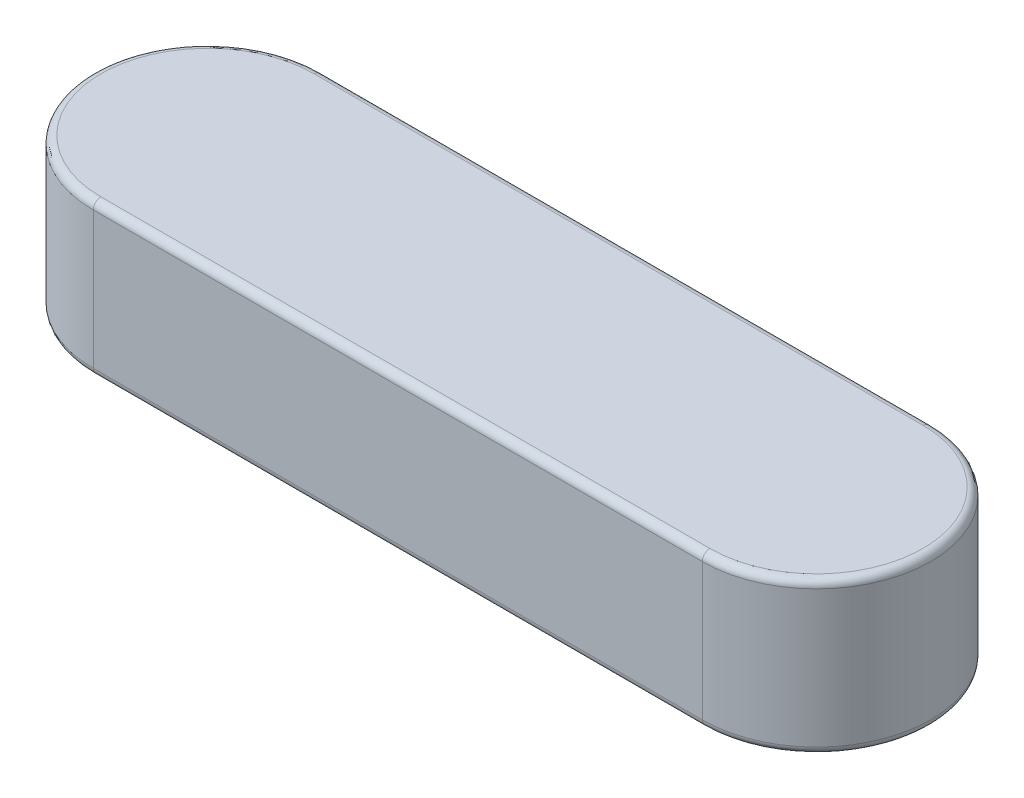
ISO-10303-21;
HEADER;
FILE_DESCRIPTION(('STEP AP214'),'2;1');
FILE_NAME('part.step','',(''),(''),'','','');
FILE_SCHEMA(('AUTOMOTIVE_DESIGN { 1 0 10303 214 1 1 1 1 }'));
ENDSEC;
DATA;
#1=APPLICATION_CONTEXT('core data for automotive mechanical design processes');
#2=APPLICATION_PROTOCOL_DEFINITION('international standard','automotive_design',2000,#1);
#3=PRODUCT_CONTEXT('',#1,'mechanical');
#4=PRODUCT('Part','Part','',(#3));
#5=PRODUCT_RELATED_PRODUCT_CATEGORY('part','',(#4));
#6=PRODUCT_DEFINITION_FORMATION('','',#4);
#7=PRODUCT_DEFINITION_CONTEXT('part definition',#1,'design');
#8=PRODUCT_DEFINITION('design','',#6,#7);
#9=PRODUCT_DEFINITION_SHAPE('','',#8);
#10=(LENGTH_UNIT() NAMED_UNIT(*) SI_UNIT(.MILLI.,.METRE.));
#11=(NAMED_UNIT(*) PLANE_ANGLE_UNIT() SI_UNIT($,.RADIAN.));
#12=(NAMED_UNIT(*) SI_UNIT($,.STERADIAN.) SOLID_ANGLE_UNIT());
#13=UNCERTAINTY_MEASURE_WITH_UNIT(LENGTH_MEASURE(1.E-05),#10,'distance_accuracy_value','');
#14=(GEOMETRIC_REPRESENTATION_CONTEXT(3) GLOBAL_UNCERTAINTY_ASSIGNED_CONTEXT((#13)) GLOBAL_UNIT_ASSIGNED_CONTEXT((#10,
#11,#12)) REPRESENTATION_CONTEXT('',''));
#15=CARTESIAN_POINT('',(0.,0.,0.));
#16=DIRECTION('',(0.,0.,1.));
#17=DIRECTION('',(1.,0.,0.));
#18=AXIS2_PLACEMENT_3D('',#15,#16,#17);
#19=CARTESIAN_POINT('',(-8.,4.,0.));
#20=DIRECTION('',(0.,-1.,0.));
#21=DIRECTION('',(0.,0.,-1.));
#22=AXIS2_PLACEMENT_3D('',#19,#20,#21);
#23=CYLINDRICAL_SURFACE('',#22,3.);
#24=DIRECTION('',(0.,-1.,0.));
#25=VECTOR('',#24,1.);
#26=CARTESIAN_POINT('',(-8.,4.,-3.));
#27=LINE('',#26,#25);
#28=CARTESIAN_POINT('',(-8.,3.8,-3.));
#29=VERTEX_POINT('',#28);
#30=CARTESIAN_POINT('',(-8.,0.2,-3.));
#31=VERTEX_POINT('',#30);
#32=EDGE_CURVE('E126',#29,#31,#27,.T.);
#33=ORIENTED_EDGE('',*,*,#32,.T.);
#34=CARTESIAN_POINT('',(-8.,0.2,0.));
#35=DIRECTION('',(0.,1.,0.));
#36=DIRECTION('',(0.,0.,1.));
#37=AXIS2_PLACEMENT_3D('',#34,#35,#36);
#38=CIRCLE('',#37,3.);
#39=CARTESIAN_POINT('',(-8.,0.2,3.));
#40=VERTEX_POINT('',#39);
#41=EDGE_CURVE('E135',#31,#40,#38,.T.);
#42=ORIENTED_EDGE('',*,*,#41,.T.);
#43=DIRECTION('',(0.,-1.,0.));
#44=VECTOR('',#43,1.);
#45=CARTESIAN_POINT('',(-8.,4.,3.));
#46=LINE('',#45,#44);
#47=CARTESIAN_POINT('',(-8.,3.8,3.));
#48=VERTEX_POINT('',#47);
#49=EDGE_CURVE('E104',#48,#40,#46,.T.);
#50=ORIENTED_EDGE('',*,*,#49,.F.);
#51=CARTESIAN_POINT('',(-8.,3.8,0.));
#52=DIRECTION('',(0.,1.,0.));
#53=DIRECTION('',(0.,0.,1.));
#54=AXIS2_PLACEMENT_3D('',#51,#52,#53);
#55=CIRCLE('',#54,3.);
#56=EDGE_CURVE('E137',#48,#29,#55,.F.);
#57=ORIENTED_EDGE('',*,*,#56,.T.);
#58=EDGE_LOOP('',(#33,#42,#50,#57));
#59=FACE_BOUND('',#58,.T.);
#60=ADVANCED_FACE('F17',(#59),#23,.T.);
#61=CARTESIAN_POINT('',(-8.,4.,3.));
#62=DIRECTION('',(0.,0.,-1.));
#63=DIRECTION('',(-1.,0.,0.));
#64=AXIS2_PLACEMENT_3D('',#61,#62,#63);
#65=PLANE('',#64);
#66=ORIENTED_EDGE('',*,*,#49,.T.);
#67=DIRECTION('',(1.,0.,0.));
#68=VECTOR('',#67,1.);
#69=CARTESIAN_POINT('',(-8.,0.2,3.));
#70=LINE('',#69,#68);
#71=CARTESIAN_POINT('',(8.,0.2,3.));
#72=VERTEX_POINT('',#71);
#73=EDGE_CURVE('E103',#40,#72,#70,.T.);
#74=ORIENTED_EDGE('',*,*,#73,.T.);
#75=DIRECTION('',(0.,-1.,0.));
#76=VECTOR('',#75,1.);
#77=CARTESIAN_POINT('',(8.,4.,3.));
#78=LINE('',#77,#76);
#79=CARTESIAN_POINT('',(8.,3.8,3.));
#80=VERTEX_POINT('',#79);
#81=EDGE_CURVE('E86',#80,#72,#78,.T.);
#82=ORIENTED_EDGE('',*,*,#81,.F.);
#83=DIRECTION('',(1.,0.,0.));
#84=VECTOR('',#83,1.);
#85=CARTESIAN_POINT('',(-8.,3.8,3.));
#86=LINE('',#85,#84);
#87=EDGE_CURVE('E100',#80,#48,#86,.F.);
#88=ORIENTED_EDGE('',*,*,#87,.T.);
#89=EDGE_LOOP('',(#66,#74,#82,#88));
#90=FACE_BOUND('',#89,.T.);
#91=ADVANCED_FACE('F99',(#90),#65,.F.);
#92=CARTESIAN_POINT('',(8.,4.,0.));
#93=DIRECTION('',(0.,-1.,0.));
#94=DIRECTION('',(0.,0.,-1.));
#95=AXIS2_PLACEMENT_3D('',#92,#93,#94);
#96=CYLINDRICAL_SURFACE('',#95,3.);
#97=ORIENTED_EDGE('',*,*,#81,.T.);
#98=CARTESIAN_POINT('',(8.,0.2,0.));
#99=DIRECTION('',(0.,1.,0.));
#100=DIRECTION('',(0.,0.,1.));
#101=AXIS2_PLACEMENT_3D('',#98,#99,#100);
#102=CIRCLE('',#101,3.);
#103=CARTESIAN_POINT('',(8.,0.2,-3.));
#104=VERTEX_POINT('',#103);
#105=EDGE_CURVE('E92',#72,#104,#102,.T.);
#106=ORIENTED_EDGE('',*,*,#105,.T.);
#107=DIRECTION('',(0.,-1.,0.));
#108=VECTOR('',#107,1.);
#109=CARTESIAN_POINT('',(8.,4.,-3.));
#110=LINE('',#109,#108);
#111=CARTESIAN_POINT('',(8.,3.8,-3.));
#112=VERTEX_POINT('',#111);
#113=EDGE_CURVE('E88',#112,#104,#110,.T.);
#114=ORIENTED_EDGE('',*,*,#113,.F.);
#115=CARTESIAN_POINT('',(8.,3.8,0.));
#116=DIRECTION('',(0.,1.,0.));
#117=DIRECTION('',(0.,0.,1.));
#118=AXIS2_PLACEMENT_3D('',#115,#116,#117);
#119=CIRCLE('',#118,3.);
#120=EDGE_CURVE('E83',#112,#80,#119,.F.);
#121=ORIENTED_EDGE('',*,*,#120,.T.);
#122=EDGE_LOOP('',(#97,#106,#114,#121));
#123=FACE_BOUND('',#122,.T.);
#124=ADVANCED_FACE('F85',(#123),#96,.T.);
#125=CARTESIAN_POINT('',(-8.,4.,-3.));
#126=DIRECTION('',(0.,0.,1.));
#127=DIRECTION('',(1.,0.,0.));
#128=AXIS2_PLACEMENT_3D('',#125,#126,#127);
#129=PLANE('',#128);
#130=ORIENTED_EDGE('',*,*,#113,.T.);
#131=DIRECTION('',(-1.,0.,0.));
#132=VECTOR('',#131,1.);
#133=CARTESIAN_POINT('',(-8.,0.2,-3.));
#134=LINE('',#133,#132);
#135=EDGE_CURVE('E139',#104,#31,#134,.T.);
#136=ORIENTED_EDGE('',*,*,#135,.T.);
#137=ORIENTED_EDGE('',*,*,#32,.F.);
#138=DIRECTION('',(-1.,0.,0.));
#139=VECTOR('',#138,1.);
#140=CARTESIAN_POINT('',(8.,3.8,-3.));
#141=LINE('',#140,#139);
#142=EDGE_CURVE('E141',#29,#112,#141,.F.);
#143=ORIENTED_EDGE('',*,*,#142,.T.);
#144=EDGE_LOOP('',(#130,#136,#137,#143));
#145=FACE_BOUND('',#144,.T.);
#146=ADVANCED_FACE('F179',(#145),#129,.F.);
#147=CARTESIAN_POINT('',(-8.,4.,0.));
#148=DIRECTION('',(0.,1.,0.));
#149=DIRECTION('',(0.,0.,1.));
#150=AXIS2_PLACEMENT_3D('',#147,#148,#149);
#151=PLANE('',#150);
#152=CARTESIAN_POINT('',(8.,4.,0.));
#153=DIRECTION('',(0.,1.,0.));
#154=DIRECTION('',(0.,0.,1.));
#155=AXIS2_PLACEMENT_3D('',#152,#153,#154);
#156=CIRCLE('',#155,2.8);
#157=CARTESIAN_POINT('',(8.,4.,2.8));
#158=VERTEX_POINT('',#157);
#159=CARTESIAN_POINT('',(8.,4.,-2.8));
#160=VERTEX_POINT('',#159);
#161=EDGE_CURVE('E26',#158,#160,#156,.T.);
#162=ORIENTED_EDGE('',*,*,#161,.T.);
#163=DIRECTION('',(-1.,0.,0.));
#164=VECTOR('',#163,1.);
#165=CARTESIAN_POINT('',(-8.,4.,-2.8));
#166=LINE('',#165,#164);
#167=CARTESIAN_POINT('',(-8.,4.,-2.8));
#168=VERTEX_POINT('',#167);
#169=EDGE_CURVE('E11',#160,#168,#166,.T.);
#170=ORIENTED_EDGE('',*,*,#169,.T.);
#171=CARTESIAN_POINT('',(-8.,4.,0.));
#172=DIRECTION('',(0.,1.,0.));
#173=DIRECTION('',(0.,0.,1.));
#174=AXIS2_PLACEMENT_3D('',#171,#172,#173);
#175=CIRCLE('',#174,2.8);
#176=CARTESIAN_POINT('',(-8.,4.,2.8));
#177=VERTEX_POINT('',#176);
#178=EDGE_CURVE('E133',#168,#177,#175,.T.);
#179=ORIENTED_EDGE('',*,*,#178,.T.);
#180=DIRECTION('',(1.,0.,0.));
#181=VECTOR('',#180,1.);
#182=CARTESIAN_POINT('',(8.,4.,2.8));
#183=LINE('',#182,#181);
#184=EDGE_CURVE('E37',#177,#158,#183,.T.);
#185=ORIENTED_EDGE('',*,*,#184,.T.);
#186=EDGE_LOOP('',(#162,#170,#179,#185));
#187=FACE_BOUND('',#186,.T.);
#188=ADVANCED_FACE('F185',(#187),#151,.T.);
#189=CARTESIAN_POINT('',(-8.,0.,0.));
#190=DIRECTION('',(0.,1.,0.));
#191=DIRECTION('',(0.,0.,1.));
#192=AXIS2_PLACEMENT_3D('',#189,#190,#191);
#193=PLANE('',#192);
#194=CARTESIAN_POINT('',(8.,0.,0.));
#195=DIRECTION('',(0.,1.,0.));
#196=DIRECTION('',(0.,0.,1.));
#197=AXIS2_PLACEMENT_3D('',#194,#195,#196);
#198=CIRCLE('',#197,2.8);
#199=CARTESIAN_POINT('',(8.,0.,-2.8));
#200=VERTEX_POINT('',#199);
#201=CARTESIAN_POINT('',(8.,0.,2.8));
#202=VERTEX_POINT('',#201);
#203=EDGE_CURVE('E146',#200,#202,#198,.F.);
#204=ORIENTED_EDGE('',*,*,#203,.T.);
#205=DIRECTION('',(1.,0.,0.));
#206=VECTOR('',#205,1.);
#207=CARTESIAN_POINT('',(-8.,0.,2.8));
#208=LINE('',#207,#206);
#209=CARTESIAN_POINT('',(-8.,0.,2.8));
#210=VERTEX_POINT('',#209);
#211=EDGE_CURVE('E93',#202,#210,#208,.F.);
#212=ORIENTED_EDGE('',*,*,#211,.T.);
#213=CARTESIAN_POINT('',(-8.,0.,0.));
#214=DIRECTION('',(0.,1.,0.));
#215=DIRECTION('',(0.,0.,1.));
#216=AXIS2_PLACEMENT_3D('',#213,#214,#215);
#217=CIRCLE('',#216,2.8);
#218=CARTESIAN_POINT('',(-8.,0.,-2.8));
#219=VERTEX_POINT('',#218);
#220=EDGE_CURVE('E150',#210,#219,#217,.F.);
#221=ORIENTED_EDGE('',*,*,#220,.T.);
#222=DIRECTION('',(-1.,0.,0.));
#223=VECTOR('',#222,1.);
#224=CARTESIAN_POINT('',(-8.,0.,-2.8));
#225=LINE('',#224,#223);
#226=EDGE_CURVE('E148',#219,#200,#225,.F.);
#227=ORIENTED_EDGE('',*,*,#226,.T.);
#228=EDGE_LOOP('',(#204,#212,#221,#227));
#229=FACE_BOUND('',#228,.T.);
#230=ADVANCED_FACE('F187',(#229),#193,.F.);
#231=CARTESIAN_POINT('',(-8.,0.2,-2.8));
#232=DIRECTION('',(-1.,0.,0.));
#233=DIRECTION('',(0.,0.,1.));
#234=AXIS2_PLACEMENT_3D('',#231,#232,#233);
#235=CYLINDRICAL_SURFACE('',#234,0.2);
#236=CARTESIAN_POINT('',(8.,0.2,-2.8));
#237=DIRECTION('',(1.,0.,0.));
#238=DIRECTION('',(0.,0.,-1.));
#239=AXIS2_PLACEMENT_3D('',#236,#237,#238);
#240=CIRCLE('',#239,0.2);
#241=EDGE_CURVE('E127',#200,#104,#240,.T.);
#242=ORIENTED_EDGE('',*,*,#241,.F.);
#243=ORIENTED_EDGE('',*,*,#226,.F.);
#244=CARTESIAN_POINT('',(-8.,0.2,-2.8));
#245=DIRECTION('',(-1.,0.,0.));
#246=DIRECTION('',(0.,0.,1.));
#247=AXIS2_PLACEMENT_3D('',#244,#245,#246);
#248=CIRCLE('',#247,0.2);
#249=EDGE_CURVE('E123',#31,#219,#248,.T.);
#250=ORIENTED_EDGE('',*,*,#249,.F.);
#251=ORIENTED_EDGE('',*,*,#135,.F.);
#252=EDGE_LOOP('',(#242,#243,#250,#251));
#253=FACE_BOUND('',#252,.T.);
#254=ADVANCED_FACE('F166',(#253),#235,.T.);
#255=CARTESIAN_POINT('',(-8.,0.2,0.));
#256=DIRECTION('',(0.,1.,0.));
#257=DIRECTION('',(0.,0.,1.));
#258=AXIS2_PLACEMENT_3D('',#255,#256,#257);
#259=TOROIDAL_SURFACE('',#258,2.8,0.2);
#260=ORIENTED_EDGE('',*,*,#249,.T.);
#261=ORIENTED_EDGE('',*,*,#220,.F.);
#262=CARTESIAN_POINT('',(-8.,0.2,2.8));
#263=DIRECTION('',(1.,0.,0.));
#264=DIRECTION('',(0.,0.,-1.));
#265=AXIS2_PLACEMENT_3D('',#262,#263,#264);
#266=CIRCLE('',#265,0.2);
#267=EDGE_CURVE('E114',#40,#210,#266,.T.);
#268=ORIENTED_EDGE('',*,*,#267,.F.);
#269=ORIENTED_EDGE('',*,*,#41,.F.);
#270=EDGE_LOOP('',(#260,#261,#268,#269));
#271=FACE_BOUND('',#270,.T.);
#272=ADVANCED_FACE('F170',(#271),#259,.T.);
#273=CARTESIAN_POINT('',(8.,0.2,0.));
#274=DIRECTION('',(0.,1.,0.));
#275=DIRECTION('',(0.,0.,1.));
#276=AXIS2_PLACEMENT_3D('',#273,#274,#275);
#277=TOROIDAL_SURFACE('',#276,2.8,0.2);
#278=ORIENTED_EDGE('',*,*,#241,.T.);
#279=ORIENTED_EDGE('',*,*,#105,.F.);
#280=CARTESIAN_POINT('',(8.,0.2,2.8));
#281=DIRECTION('',(-1.,0.,0.));
#282=DIRECTION('',(0.,0.,1.));
#283=AXIS2_PLACEMENT_3D('',#280,#281,#282);
#284=CIRCLE('',#283,0.2);
#285=EDGE_CURVE('E113',#202,#72,#284,.T.);
#286=ORIENTED_EDGE('',*,*,#285,.F.);
#287=ORIENTED_EDGE('',*,*,#203,.F.);
#288=EDGE_LOOP('',(#278,#279,#286,#287));
#289=FACE_BOUND('',#288,.T.);
#290=ADVANCED_FACE('F178',(#289),#277,.T.);
#291=CARTESIAN_POINT('',(-8.,0.2,2.8));
#292=DIRECTION('',(1.,0.,0.));
#293=DIRECTION('',(0.,0.,-1.));
#294=AXIS2_PLACEMENT_3D('',#291,#292,#293);
#295=CYLINDRICAL_SURFACE('',#294,0.2);
#296=ORIENTED_EDGE('',*,*,#267,.T.);
#297=ORIENTED_EDGE('',*,*,#211,.F.);
#298=ORIENTED_EDGE('',*,*,#285,.T.);
#299=ORIENTED_EDGE('',*,*,#73,.F.);
#300=EDGE_LOOP('',(#296,#297,#298,#299));
#301=FACE_BOUND('',#300,.T.);
#302=ADVANCED_FACE('F173',(#301),#295,.T.);
#303=CARTESIAN_POINT('',(-8.,3.8,2.8));
#304=DIRECTION('',(-1.,0.,0.));
#305=DIRECTION('',(0.,0.,1.));
#306=AXIS2_PLACEMENT_3D('',#303,#304,#305);
#307=CYLINDRICAL_SURFACE('',#306,0.2);
#308=CARTESIAN_POINT('',(-8.,3.8,2.8));
#309=DIRECTION('',(-1.,0.,0.));
#310=DIRECTION('',(0.,0.,1.));
#311=AXIS2_PLACEMENT_3D('',#308,#309,#310);
#312=CIRCLE('',#311,0.2);
#313=EDGE_CURVE('E109',#48,#177,#312,.T.);
#314=ORIENTED_EDGE('',*,*,#313,.F.);
#315=ORIENTED_EDGE('',*,*,#87,.F.);
#316=CARTESIAN_POINT('',(8.,3.8,2.8));
#317=DIRECTION('',(1.,0.,0.));
#318=DIRECTION('',(0.,0.,-1.));
#319=AXIS2_PLACEMENT_3D('',#316,#317,#318);
#320=CIRCLE('',#319,0.2);
#321=EDGE_CURVE('E21',#158,#80,#320,.T.);
#322=ORIENTED_EDGE('',*,*,#321,.F.);
#323=ORIENTED_EDGE('',*,*,#184,.F.);
#324=EDGE_LOOP('',(#314,#315,#322,#323));
#325=FACE_BOUND('',#324,.T.);
#326=ADVANCED_FACE('F19',(#325),#307,.T.);
#327=CARTESIAN_POINT('',(8.,3.8,0.));
#328=DIRECTION('',(0.,1.,0.));
#329=DIRECTION('',(0.,0.,1.));
#330=AXIS2_PLACEMENT_3D('',#327,#328,#329);
#331=TOROIDAL_SURFACE('',#330,2.8,0.2);
#332=ORIENTED_EDGE('',*,*,#321,.T.);
#333=ORIENTED_EDGE('',*,*,#120,.F.);
#334=CARTESIAN_POINT('',(8.,3.8,-2.8));
#335=DIRECTION('',(-1.,0.,0.));
#336=DIRECTION('',(0.,0.,1.));
#337=AXIS2_PLACEMENT_3D('',#334,#335,#336);
#338=CIRCLE('',#337,0.2);
#339=EDGE_CURVE('E116',#160,#112,#338,.T.);
#340=ORIENTED_EDGE('',*,*,#339,.F.);
#341=ORIENTED_EDGE('',*,*,#161,.F.);
#342=EDGE_LOOP('',(#332,#333,#340,#341));
#343=FACE_BOUND('',#342,.T.);
#344=ADVANCED_FACE('F112',(#343),#331,.T.);
#345=CARTESIAN_POINT('',(-8.,3.8,0.));
#346=DIRECTION('',(0.,1.,0.));
#347=DIRECTION('',(0.,0.,1.));
#348=AXIS2_PLACEMENT_3D('',#345,#346,#347);
#349=TOROIDAL_SURFACE('',#348,2.8,0.2);
#350=ORIENTED_EDGE('',*,*,#313,.T.);
#351=ORIENTED_EDGE('',*,*,#178,.F.);
#352=CARTESIAN_POINT('',(-8.,3.8,-2.8));
#353=DIRECTION('',(1.,0.,0.));
#354=DIRECTION('',(0.,0.,-1.));
#355=AXIS2_PLACEMENT_3D('',#352,#353,#354);
#356=CIRCLE('',#355,0.2);
#357=EDGE_CURVE('E119',#29,#168,#356,.T.);
#358=ORIENTED_EDGE('',*,*,#357,.F.);
#359=ORIENTED_EDGE('',*,*,#56,.F.);
#360=EDGE_LOOP('',(#350,#351,#358,#359));
#361=FACE_BOUND('',#360,.T.);
#362=ADVANCED_FACE('F184',(#361),#349,.T.);
#363=CARTESIAN_POINT('',(-8.,3.8,-2.8));
#364=DIRECTION('',(1.,0.,0.));
#365=DIRECTION('',(0.,0.,-1.));
#366=AXIS2_PLACEMENT_3D('',#363,#364,#365);
#367=CYLINDRICAL_SURFACE('',#366,0.2);
#368=ORIENTED_EDGE('',*,*,#339,.T.);
#369=ORIENTED_EDGE('',*,*,#142,.F.);
#370=ORIENTED_EDGE('',*,*,#357,.T.);
#371=ORIENTED_EDGE('',*,*,#169,.F.);
#372=EDGE_LOOP('',(#368,#369,#370,#371));
#373=FACE_BOUND('',#372,.T.);
#374=ADVANCED_FACE('F182',(#373),#367,.T.);
#375=CLOSED_SHELL('',(#60,#91,#124,#146,#188,#230,#254,#272,#290,#302,#326,#344,#362,#374));
#376=MANIFOLD_SOLID_BREP('B1',#375);
#377=ADVANCED_BREP_SHAPE_REPRESENTATION('',(#18,#376),#14);
#378=SHAPE_DEFINITION_REPRESENTATION(#9,#377);
ENDSEC;
END-ISO-10303-21;
